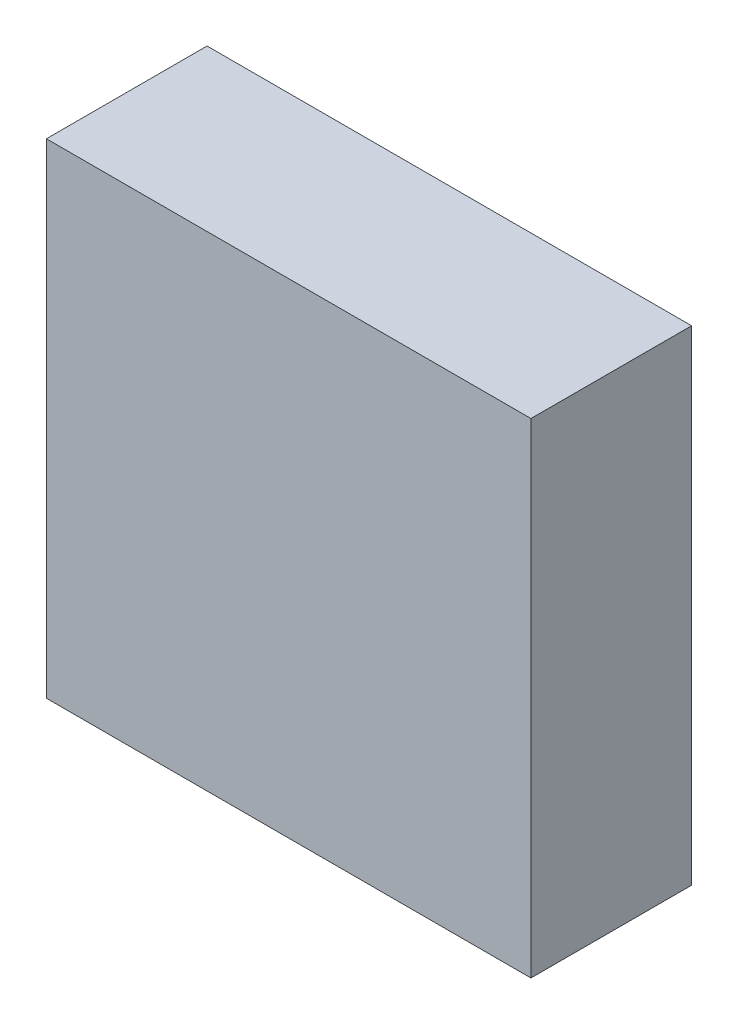
ISO-10303-21;
HEADER;
FILE_DESCRIPTION(('STEP AP214'),'2;1');
FILE_NAME('part.step','',(''),(''),'','','');
FILE_SCHEMA(('AUTOMOTIVE_DESIGN { 1 0 10303 214 1 1 1 1 }'));
ENDSEC;
DATA;
#1=APPLICATION_CONTEXT('core data for automotive mechanical design processes');
#2=APPLICATION_PROTOCOL_DEFINITION('international standard','automotive_design',2000,#1);
#3=PRODUCT_CONTEXT('',#1,'mechanical');
#4=PRODUCT('Part','Part','',(#3));
#5=PRODUCT_RELATED_PRODUCT_CATEGORY('part','',(#4));
#6=PRODUCT_DEFINITION_FORMATION('','',#4);
#7=PRODUCT_DEFINITION_CONTEXT('part definition',#1,'design');
#8=PRODUCT_DEFINITION('design','',#6,#7);
#9=PRODUCT_DEFINITION_SHAPE('','',#8);
#10=(LENGTH_UNIT() NAMED_UNIT(*) SI_UNIT(.MILLI.,.METRE.));
#11=(NAMED_UNIT(*) PLANE_ANGLE_UNIT() SI_UNIT($,.RADIAN.));
#12=(NAMED_UNIT(*) SI_UNIT($,.STERADIAN.) SOLID_ANGLE_UNIT());
#13=UNCERTAINTY_MEASURE_WITH_UNIT(LENGTH_MEASURE(1.E-05),#10,'distance_accuracy_value','');
#14=(GEOMETRIC_REPRESENTATION_CONTEXT(3) GLOBAL_UNCERTAINTY_ASSIGNED_CONTEXT((#13)) GLOBAL_UNIT_ASSIGNED_CONTEXT((#10,
#11,#12)) REPRESENTATION_CONTEXT('',''));
#15=CARTESIAN_POINT('',(0.,0.,0.));
#16=DIRECTION('',(0.,0.,1.));
#17=DIRECTION('',(1.,0.,0.));
#18=AXIS2_PLACEMENT_3D('',#15,#16,#17);
#19=CARTESIAN_POINT('',(4.75,-4.75,1.575));
#20=DIRECTION('',(-1.,0.,0.));
#21=DIRECTION('',(0.,0.,1.));
#22=AXIS2_PLACEMENT_3D('',#19,#20,#21);
#23=PLANE('',#22);
#24=DIRECTION('',(0.,1.,0.));
#25=VECTOR('',#24,1.);
#26=CARTESIAN_POINT('',(4.75,-4.75,-1.575));
#27=LINE('',#26,#25);
#28=CARTESIAN_POINT('',(4.75,-4.75,-1.575));
#29=VERTEX_POINT('',#28);
#30=CARTESIAN_POINT('',(4.75,4.75,-1.575));
#31=VERTEX_POINT('',#30);
#32=EDGE_CURVE('E96',#29,#31,#27,.T.);
#33=ORIENTED_EDGE('',*,*,#32,.T.);
#34=DIRECTION('',(0.,0.,-1.));
#35=VECTOR('',#34,1.);
#36=CARTESIAN_POINT('',(4.75,4.75,1.575));
#37=LINE('',#36,#35);
#38=CARTESIAN_POINT('',(4.75,4.75,1.575));
#39=VERTEX_POINT('',#38);
#40=EDGE_CURVE('E11',#39,#31,#37,.T.);
#41=ORIENTED_EDGE('',*,*,#40,.F.);
#42=DIRECTION('',(0.,1.,0.));
#43=VECTOR('',#42,1.);
#44=CARTESIAN_POINT('',(4.75,-4.75,1.575));
#45=LINE('',#44,#43);
#46=CARTESIAN_POINT('',(4.75,-4.75,1.575));
#47=VERTEX_POINT('',#46);
#48=EDGE_CURVE('E84',#47,#39,#45,.T.);
#49=ORIENTED_EDGE('',*,*,#48,.F.);
#50=DIRECTION('',(0.,0.,-1.));
#51=VECTOR('',#50,1.);
#52=CARTESIAN_POINT('',(4.75,-4.75,1.575));
#53=LINE('',#52,#51);
#54=EDGE_CURVE('E92',#47,#29,#53,.T.);
#55=ORIENTED_EDGE('',*,*,#54,.T.);
#56=EDGE_LOOP('',(#33,#41,#49,#55));
#57=FACE_BOUND('',#56,.T.);
#58=ADVANCED_FACE('F33',(#57),#23,.F.);
#59=CARTESIAN_POINT('',(-4.75,4.75,1.575));
#60=DIRECTION('',(0.,-1.,0.));
#61=DIRECTION('',(0.,0.,-1.));
#62=AXIS2_PLACEMENT_3D('',#59,#60,#61);
#63=PLANE('',#62);
#64=DIRECTION('',(-1.,0.,0.));
#65=VECTOR('',#64,1.);
#66=CARTESIAN_POINT('',(-4.75,4.75,-1.575));
#67=LINE('',#66,#65);
#68=CARTESIAN_POINT('',(-4.75,4.75,-1.575));
#69=VERTEX_POINT('',#68);
#70=EDGE_CURVE('E88',#31,#69,#67,.T.);
#71=ORIENTED_EDGE('',*,*,#70,.T.);
#72=DIRECTION('',(0.,0.,-1.));
#73=VECTOR('',#72,1.);
#74=CARTESIAN_POINT('',(-4.75,4.75,1.575));
#75=LINE('',#74,#73);
#76=CARTESIAN_POINT('',(-4.75,4.75,1.575));
#77=VERTEX_POINT('',#76);
#78=EDGE_CURVE('E41',#77,#69,#75,.T.);
#79=ORIENTED_EDGE('',*,*,#78,.F.);
#80=DIRECTION('',(-1.,0.,0.));
#81=VECTOR('',#80,1.);
#82=CARTESIAN_POINT('',(-4.75,4.75,1.575));
#83=LINE('',#82,#81);
#84=EDGE_CURVE('E79',#39,#77,#83,.T.);
#85=ORIENTED_EDGE('',*,*,#84,.F.);
#86=ORIENTED_EDGE('',*,*,#40,.T.);
#87=EDGE_LOOP('',(#71,#79,#85,#86));
#88=FACE_BOUND('',#87,.T.);
#89=ADVANCED_FACE('F87',(#88),#63,.F.);
#90=CARTESIAN_POINT('',(-4.75,-4.75,1.575));
#91=DIRECTION('',(1.,0.,0.));
#92=DIRECTION('',(0.,0.,-1.));
#93=AXIS2_PLACEMENT_3D('',#90,#91,#92);
#94=PLANE('',#93);
#95=DIRECTION('',(0.,-1.,0.));
#96=VECTOR('',#95,1.);
#97=CARTESIAN_POINT('',(-4.75,-4.75,-1.575));
#98=LINE('',#97,#96);
#99=CARTESIAN_POINT('',(-4.75,-4.75,-1.575));
#100=VERTEX_POINT('',#99);
#101=EDGE_CURVE('E66',#69,#100,#98,.T.);
#102=ORIENTED_EDGE('',*,*,#101,.T.);
#103=DIRECTION('',(0.,0.,-1.));
#104=VECTOR('',#103,1.);
#105=CARTESIAN_POINT('',(-4.75,-4.75,1.575));
#106=LINE('',#105,#104);
#107=CARTESIAN_POINT('',(-4.75,-4.75,1.575));
#108=VERTEX_POINT('',#107);
#109=EDGE_CURVE('E89',#108,#100,#106,.T.);
#110=ORIENTED_EDGE('',*,*,#109,.F.);
#111=DIRECTION('',(0.,-1.,0.));
#112=VECTOR('',#111,1.);
#113=CARTESIAN_POINT('',(-4.75,-4.75,1.575));
#114=LINE('',#113,#112);
#115=EDGE_CURVE('E82',#77,#108,#114,.T.);
#116=ORIENTED_EDGE('',*,*,#115,.F.);
#117=ORIENTED_EDGE('',*,*,#78,.T.);
#118=EDGE_LOOP('',(#102,#110,#116,#117));
#119=FACE_BOUND('',#118,.T.);
#120=ADVANCED_FACE('F90',(#119),#94,.F.);
#121=CARTESIAN_POINT('',(-4.75,-4.75,1.575));
#122=DIRECTION('',(0.,1.,0.));
#123=DIRECTION('',(0.,0.,1.));
#124=AXIS2_PLACEMENT_3D('',#121,#122,#123);
#125=PLANE('',#124);
#126=DIRECTION('',(1.,0.,0.));
#127=VECTOR('',#126,1.);
#128=CARTESIAN_POINT('',(-4.75,-4.75,-1.575));
#129=LINE('',#128,#127);
#130=EDGE_CURVE('E72',#100,#29,#129,.T.);
#131=ORIENTED_EDGE('',*,*,#130,.T.);
#132=ORIENTED_EDGE('',*,*,#54,.F.);
#133=DIRECTION('',(1.,0.,0.));
#134=VECTOR('',#133,1.);
#135=CARTESIAN_POINT('',(-4.75,-4.75,1.575));
#136=LINE('',#135,#134);
#137=EDGE_CURVE('E49',#108,#47,#136,.T.);
#138=ORIENTED_EDGE('',*,*,#137,.F.);
#139=ORIENTED_EDGE('',*,*,#109,.T.);
#140=EDGE_LOOP('',(#131,#132,#138,#139));
#141=FACE_BOUND('',#140,.T.);
#142=ADVANCED_FACE('F103',(#141),#125,.F.);
#143=CARTESIAN_POINT('',(0.,0.,1.575));
#144=DIRECTION('',(0.,0.,-1.));
#145=DIRECTION('',(-1.,0.,0.));
#146=AXIS2_PLACEMENT_3D('',#143,#144,#145);
#147=PLANE('',#146);
#148=ORIENTED_EDGE('',*,*,#48,.T.);
#149=ORIENTED_EDGE('',*,*,#84,.T.);
#150=ORIENTED_EDGE('',*,*,#115,.T.);
#151=ORIENTED_EDGE('',*,*,#137,.T.);
#152=EDGE_LOOP('',(#148,#149,#150,#151));
#153=FACE_BOUND('',#152,.T.);
#154=ADVANCED_FACE('F80',(#153),#147,.F.);
#155=CARTESIAN_POINT('',(0.,0.,-1.575));
#156=DIRECTION('',(0.,0.,-1.));
#157=DIRECTION('',(-1.,0.,0.));
#158=AXIS2_PLACEMENT_3D('',#155,#156,#157);
#159=PLANE('',#158);
#160=ORIENTED_EDGE('',*,*,#32,.F.);
#161=ORIENTED_EDGE('',*,*,#130,.F.);
#162=ORIENTED_EDGE('',*,*,#101,.F.);
#163=ORIENTED_EDGE('',*,*,#70,.F.);
#164=EDGE_LOOP('',(#160,#161,#162,#163));
#165=FACE_BOUND('',#164,.T.);
#166=ADVANCED_FACE('F106',(#165),#159,.T.);
#167=CLOSED_SHELL('',(#58,#89,#120,#142,#154,#166));
#168=MANIFOLD_SOLID_BREP('B2',#167);
#169=ADVANCED_BREP_SHAPE_REPRESENTATION('',(#18,#168),#14);
#170=SHAPE_DEFINITION_REPRESENTATION(#9,#169);
ENDSEC;
END-ISO-10303-21;
